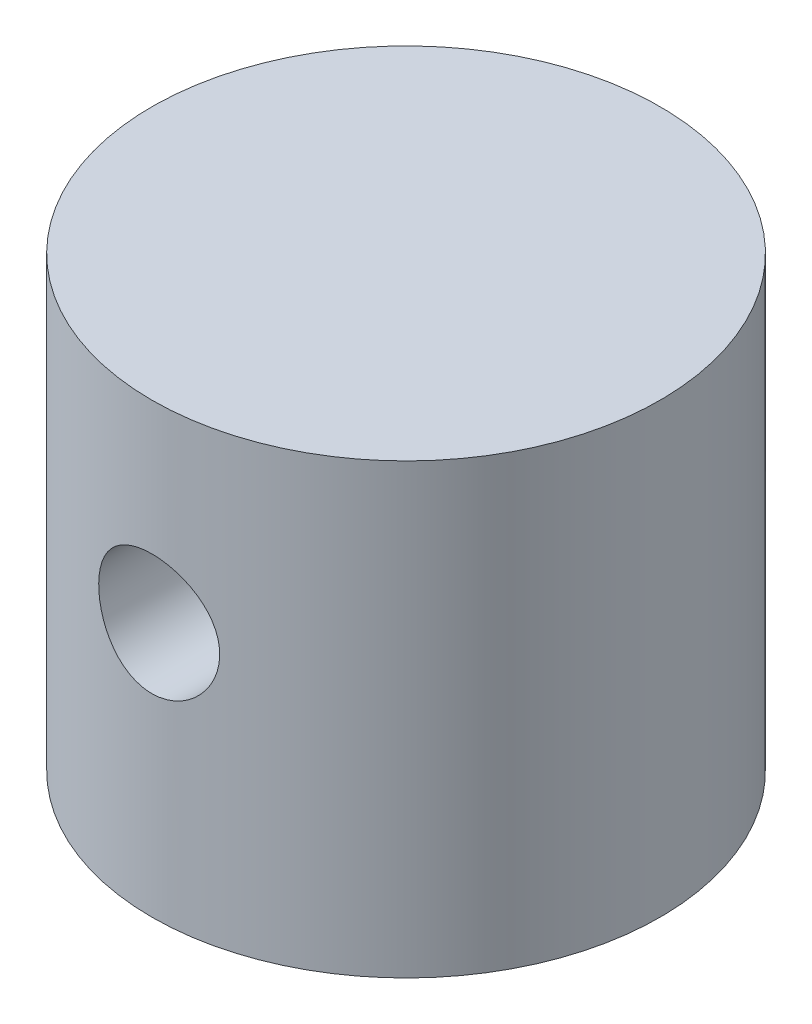
ISO-10303-21;
HEADER;
FILE_DESCRIPTION(('STEP AP214'),'2;1');
FILE_NAME('part.step','',(''),(''),'','','');
FILE_SCHEMA(('AUTOMOTIVE_DESIGN { 1 0 10303 214 1 1 1 1 }'));
ENDSEC;
DATA;
#1=APPLICATION_CONTEXT('core data for automotive mechanical design processes');
#2=APPLICATION_PROTOCOL_DEFINITION('international standard','automotive_design',2000,#1);
#3=PRODUCT_CONTEXT('',#1,'mechanical');
#4=PRODUCT('Part','Part','',(#3));
#5=PRODUCT_RELATED_PRODUCT_CATEGORY('part','',(#4));
#6=PRODUCT_DEFINITION_FORMATION('','',#4);
#7=PRODUCT_DEFINITION_CONTEXT('part definition',#1,'design');
#8=PRODUCT_DEFINITION('design','',#6,#7);
#9=PRODUCT_DEFINITION_SHAPE('','',#8);
#10=(LENGTH_UNIT() NAMED_UNIT(*) SI_UNIT(.MILLI.,.METRE.));
#11=(NAMED_UNIT(*) PLANE_ANGLE_UNIT() SI_UNIT($,.RADIAN.));
#12=(NAMED_UNIT(*) SI_UNIT($,.STERADIAN.) SOLID_ANGLE_UNIT());
#13=UNCERTAINTY_MEASURE_WITH_UNIT(LENGTH_MEASURE(1.E-05),#10,'distance_accuracy_value','');
#14=(GEOMETRIC_REPRESENTATION_CONTEXT(3) GLOBAL_UNCERTAINTY_ASSIGNED_CONTEXT((#13)) GLOBAL_UNIT_ASSIGNED_CONTEXT((#10,
#11,#12)) REPRESENTATION_CONTEXT('',''));
#15=CARTESIAN_POINT('',(0.,0.,0.));
#16=DIRECTION('',(0.,0.,1.));
#17=DIRECTION('',(1.,0.,0.));
#18=AXIS2_PLACEMENT_3D('',#15,#16,#17);
#19=CARTESIAN_POINT('',(2.7500000118,77.0000027942,22.5685520688));
#20=DIRECTION('',(0.,1.,0.));
#21=DIRECTION('',(0.,0.,1.));
#22=AXIS2_PLACEMENT_3D('',#19,#20,#21);
#23=CYLINDRICAL_SURFACE('',#22,6.2499999968);
#24=CARTESIAN_POINT('',(2.7500000118,77.0000027942,22.5685520688));
#25=DIRECTION('',(0.,1.,0.));
#26=DIRECTION('',(0.,0.,1.));
#27=AXIS2_PLACEMENT_3D('',#24,#25,#26);
#28=CIRCLE('',#27,6.2499999968);
#29=CARTESIAN_POINT('',(2.7500000118,77.0000027942,28.8185520656));
#30=VERTEX_POINT('',#29);
#31=CARTESIAN_POINT('',(2.7500000118,77.0000027942,16.318552072));
#32=VERTEX_POINT('',#31);
#33=EDGE_CURVE('E55',#30,#32,#28,.T.);
#34=ORIENTED_EDGE('',*,*,#33,.F.);
#35=DIRECTION('',(0.,1.,0.));
#36=VECTOR('',#35,1.);
#37=CARTESIAN_POINT('',(2.7500000118,82.2500027971,28.8185520656));
#38=LINE('',#37,#36);
#39=CARTESIAN_POINT('',(2.7500000118,87.5000028,28.8185520656));
#40=VERTEX_POINT('',#39);
#41=EDGE_CURVE('E51',#30,#40,#38,.T.);
#42=ORIENTED_EDGE('',*,*,#41,.T.);
#43=CARTESIAN_POINT('',(2.7500000118,87.5000028,22.5685520688));
#44=DIRECTION('',(0.,1.,0.));
#45=DIRECTION('',(0.,0.,1.));
#46=AXIS2_PLACEMENT_3D('',#43,#44,#45);
#47=CIRCLE('',#46,6.2499999968);
#48=CARTESIAN_POINT('',(2.7500000118,87.5000028,16.318552072));
#49=VERTEX_POINT('',#48);
#50=EDGE_CURVE('E20',#40,#49,#47,.T.);
#51=ORIENTED_EDGE('',*,*,#50,.T.);
#52=DIRECTION('',(0.,-1.,0.));
#53=VECTOR('',#52,1.);
#54=CARTESIAN_POINT('',(2.7500000118,82.2500027971,16.318552072));
#55=LINE('',#54,#53);
#56=EDGE_CURVE('E129',#49,#32,#55,.T.);
#57=ORIENTED_EDGE('',*,*,#56,.T.);
#58=EDGE_LOOP('',(#34,#42,#51,#57));
#59=FACE_BOUND('',#58,.T.);
#60=ADVANCED_FACE('F16',(#59),#23,.F.);
#61=CARTESIAN_POINT('',(-2.7500000118,77.0000027942,22.5685520688));
#62=DIRECTION('',(0.,1.,0.));
#63=DIRECTION('',(0.,0.,1.));
#64=AXIS2_PLACEMENT_3D('',#61,#62,#63);
#65=CYLINDRICAL_SURFACE('',#64,6.2499999968);
#66=CARTESIAN_POINT('',(-2.7500000118,77.0000027942,22.5685520688));
#67=DIRECTION('',(0.,1.,0.));
#68=DIRECTION('',(0.,0.,1.));
#69=AXIS2_PLACEMENT_3D('',#66,#67,#68);
#70=CIRCLE('',#69,6.2499999968);
#71=CARTESIAN_POINT('',(-2.7500000118,77.0000027942,16.318552072));
#72=VERTEX_POINT('',#71);
#73=CARTESIAN_POINT('',(-2.7500000118,77.0000027942,28.8185520656));
#74=VERTEX_POINT('',#73);
#75=EDGE_CURVE('E63',#72,#74,#70,.T.);
#76=ORIENTED_EDGE('',*,*,#75,.F.);
#77=DIRECTION('',(0.,1.,0.));
#78=VECTOR('',#77,1.);
#79=CARTESIAN_POINT('',(-2.7500000118,82.2500027971,16.318552072));
#80=LINE('',#79,#78);
#81=CARTESIAN_POINT('',(-2.7500000118,87.5000028,16.318552072));
#82=VERTEX_POINT('',#81);
#83=EDGE_CURVE('E35',#72,#82,#80,.T.);
#84=ORIENTED_EDGE('',*,*,#83,.T.);
#85=CARTESIAN_POINT('',(-2.7500000118,87.5000028,22.5685520688));
#86=DIRECTION('',(0.,1.,0.));
#87=DIRECTION('',(0.,0.,1.));
#88=AXIS2_PLACEMENT_3D('',#85,#86,#87);
#89=CIRCLE('',#88,6.2499999968);
#90=CARTESIAN_POINT('',(-2.7500000118,87.5000028,28.8185520656));
#91=VERTEX_POINT('',#90);
#92=EDGE_CURVE('E65',#82,#91,#89,.T.);
#93=ORIENTED_EDGE('',*,*,#92,.T.);
#94=DIRECTION('',(0.,-1.,0.));
#95=VECTOR('',#94,1.);
#96=CARTESIAN_POINT('',(-2.7500000118,82.2500027971,28.8185520656));
#97=LINE('',#96,#95);
#98=EDGE_CURVE('E60',#91,#74,#97,.T.);
#99=ORIENTED_EDGE('',*,*,#98,.T.);
#100=EDGE_LOOP('',(#76,#84,#93,#99));
#101=FACE_BOUND('',#100,.T.);
#102=ADVANCED_FACE('F62',(#101),#65,.F.);
#103=CARTESIAN_POINT('',(-9.1079999958,87.5000028,28.8185520656));
#104=DIRECTION('',(0.,1.,0.));
#105=DIRECTION('',(1.,0.,0.));
#106=AXIS2_PLACEMENT_3D('',#103,#104,#105);
#107=PLANE('',#106);
#108=ORIENTED_EDGE('',*,*,#92,.F.);
#109=DIRECTION('',(1.,0.,0.));
#110=VECTOR('',#109,1.);
#111=CARTESIAN_POINT('',(0.,87.5000028,16.318552072));
#112=LINE('',#111,#110);
#113=EDGE_CURVE('E125',#82,#49,#112,.T.);
#114=ORIENTED_EDGE('',*,*,#113,.T.);
#115=ORIENTED_EDGE('',*,*,#50,.F.);
#116=DIRECTION('',(-1.,0.,0.));
#117=VECTOR('',#116,1.);
#118=CARTESIAN_POINT('',(0.,87.5000028,28.8185520656));
#119=LINE('',#118,#117);
#120=EDGE_CURVE('E80',#40,#91,#119,.T.);
#121=ORIENTED_EDGE('',*,*,#120,.T.);
#122=EDGE_LOOP('',(#108,#114,#115,#121));
#123=FACE_BOUND('',#122,.T.);
#124=ADVANCED_FACE('F132',(#123),#107,.F.);
#125=CARTESIAN_POINT('',(-9.8670000018,77.0000027942,12.701552067));
#126=DIRECTION('',(0.,-1.,0.));
#127=DIRECTION('',(1.,0.,0.));
#128=AXIS2_PLACEMENT_3D('',#125,#126,#127);
#129=PLANE('',#128);
#130=DIRECTION('',(-1.,0.,0.));
#131=VECTOR('',#130,1.);
#132=CARTESIAN_POINT('',(0.,77.0000027942,16.318552072));
#133=LINE('',#132,#131);
#134=EDGE_CURVE('E76',#32,#72,#133,.T.);
#135=ORIENTED_EDGE('',*,*,#134,.T.);
#136=ORIENTED_EDGE('',*,*,#75,.T.);
#137=DIRECTION('',(1.,0.,0.));
#138=VECTOR('',#137,1.);
#139=CARTESIAN_POINT('',(0.,77.0000027942,28.8185520656));
#140=LINE('',#139,#138);
#141=EDGE_CURVE('E70',#74,#30,#140,.T.);
#142=ORIENTED_EDGE('',*,*,#141,.T.);
#143=ORIENTED_EDGE('',*,*,#33,.T.);
#144=EDGE_LOOP('',(#135,#136,#142,#143));
#145=FACE_BOUND('',#144,.T.);
#146=CARTESIAN_POINT('',(0.,77.0000027942,22.5685520688));
#147=DIRECTION('',(0.,-1.,0.));
#148=DIRECTION('',(0.,0.,-1.));
#149=AXIS2_PLACEMENT_3D('',#146,#147,#148);
#150=CIRCLE('',#149,9.7500000072);
#151=CARTESIAN_POINT('',(0.,77.0000027942,12.8185520616));
#152=VERTEX_POINT('',#151);
#153=EDGE_CURVE('E123',#152,#152,#150,.F.);
#154=ORIENTED_EDGE('',*,*,#153,.F.);
#155=EDGE_LOOP('',(#154));
#156=FACE_BOUND('',#155,.T.);
#157=ADVANCED_FACE('F73',(#145,#156),#129,.T.);
#158=CARTESIAN_POINT('',(-2.7500000118,77.0000027942,28.8185520656));
#159=DIRECTION('',(0.,0.,1.));
#160=DIRECTION('',(1.,0.,0.));
#161=AXIS2_PLACEMENT_3D('',#158,#159,#160);
#162=PLANE('',#161);
#163=CARTESIAN_POINT('',(0.,81.5000028112,28.8185520656));
#164=DIRECTION('',(0.,0.,-1.));
#165=DIRECTION('',(0.,1.,0.));
#166=AXIS2_PLACEMENT_3D('',#163,#164,#165);
#167=CIRCLE('',#166,2.5000000038);
#168=CARTESIAN_POINT('',(0.,84.000002815,28.8185520656));
#169=VERTEX_POINT('',#168);
#170=EDGE_CURVE('E120',#169,#169,#167,.T.);
#171=ORIENTED_EDGE('',*,*,#170,.F.);
#172=EDGE_LOOP('',(#171));
#173=FACE_BOUND('',#172,.T.);
#174=ORIENTED_EDGE('',*,*,#41,.F.);
#175=ORIENTED_EDGE('',*,*,#141,.F.);
#176=ORIENTED_EDGE('',*,*,#98,.F.);
#177=ORIENTED_EDGE('',*,*,#120,.F.);
#178=EDGE_LOOP('',(#174,#175,#176,#177));
#179=FACE_BOUND('',#178,.T.);
#180=ADVANCED_FACE('F78',(#173,#179),#162,.F.);
#181=CARTESIAN_POINT('',(2.7500000118,77.0000027942,16.318552072));
#182=DIRECTION('',(0.,0.,-1.));
#183=DIRECTION('',(-1.,0.,0.));
#184=AXIS2_PLACEMENT_3D('',#181,#182,#183);
#185=PLANE('',#184);
#186=CARTESIAN_POINT('',(0.,81.5000028112,16.318552072));
#187=DIRECTION('',(0.,0.,-1.));
#188=DIRECTION('',(-1.,0.,0.));
#189=AXIS2_PLACEMENT_3D('',#186,#187,#188);
#190=CIRCLE('',#189,2.49999997839999);
#191=CARTESIAN_POINT('',(-2.49999997839999,81.5000028112,16.318552072));
#192=VERTEX_POINT('',#191);
#193=EDGE_CURVE('E117',#192,#192,#190,.F.);
#194=ORIENTED_EDGE('',*,*,#193,.F.);
#195=EDGE_LOOP('',(#194));
#196=FACE_BOUND('',#195,.T.);
#197=ORIENTED_EDGE('',*,*,#83,.F.);
#198=ORIENTED_EDGE('',*,*,#134,.F.);
#199=ORIENTED_EDGE('',*,*,#56,.F.);
#200=ORIENTED_EDGE('',*,*,#113,.F.);
#201=EDGE_LOOP('',(#197,#198,#199,#200));
#202=FACE_BOUND('',#201,.T.);
#203=ADVANCED_FACE('F135',(#196,#202),#185,.F.);
#204=CARTESIAN_POINT('',(0.,77.0000027942,22.5685520688));
#205=DIRECTION('',(0.,-1.,0.));
#206=DIRECTION('',(0.,0.,-1.));
#207=AXIS2_PLACEMENT_3D('',#204,#205,#206);
#208=CYLINDRICAL_SURFACE('',#207,9.7500000072);
#209=ORIENTED_EDGE('',*,*,#153,.T.);
#210=EDGE_LOOP('',(#209));
#211=FACE_BOUND('',#210,.T.);
#212=CARTESIAN_POINT('',(0.,71.0000028054,22.5685520688));
#213=DIRECTION('',(0.,-1.,0.));
#214=DIRECTION('',(0.,0.,-1.));
#215=AXIS2_PLACEMENT_3D('',#212,#213,#214);
#216=CIRCLE('',#215,9.7500000072);
#217=CARTESIAN_POINT('',(0.,71.0000028054,12.8185520616));
#218=VERTEX_POINT('',#217);
#219=EDGE_CURVE('E114',#218,#218,#216,.T.);
#220=ORIENTED_EDGE('',*,*,#219,.T.);
#221=EDGE_LOOP('',(#220));
#222=FACE_BOUND('',#221,.T.);
#223=ADVANCED_FACE('F105',(#211,#222),#208,.F.);
#224=CARTESIAN_POINT('',(0.,81.5000028112,33.0940520744));
#225=DIRECTION('',(0.,0.,-1.));
#226=DIRECTION('',(0.,1.,0.));
#227=AXIS2_PLACEMENT_3D('',#224,#225,#226);
#228=CYLINDRICAL_SURFACE('',#227,2.5000000038);
#229=CARTESIAN_POINT('',(-3.7713360540755E-10,79.0000028074,33.0685520746));
#230=CARTESIAN_POINT('',(0.138292949162326,79.0000088104762,33.0685486359888));
#231=CARTESIAN_POINT('',(0.276666316818153,79.0115199167967,33.065791526457));
#232=CARTESIAN_POINT('',(0.549495294458109,79.0572123277179,33.0550553082801));
#233=CARTESIAN_POINT('',(0.683946912006523,79.0914159469237,33.0470710596478));
#234=CARTESIAN_POINT('',(0.944902494976897,79.1813442063632,33.0267675441859));
#235=CARTESIAN_POINT('',(1.0714163048271,79.2370415512946,33.0144537772521));
#236=CARTESIAN_POINT('',(1.31328838593754,79.3682873352447,32.9868106363306));
#237=CARTESIAN_POINT('',(1.42864768343932,79.4438339457022,32.9714815401548));
#238=CARTESIAN_POINT('',(1.6471181228244,79.6141328510857,32.9391554963471));
#239=CARTESIAN_POINT('',(1.74999059861146,79.7091868286104,32.9221348311348));
#240=CARTESIAN_POINT('',(1.93851585202774,79.9151825217857,32.8885011930524));
#241=CARTESIAN_POINT('',(2.02416322681473,80.026129203732,32.8718883495301));
#242=CARTESIAN_POINT('',(2.176907790891,80.262602520137,32.8407110291521));
#243=CARTESIAN_POINT('',(2.24373398396869,80.3883085088242,32.8261778268623));
#244=CARTESIAN_POINT('',(2.35515070225879,80.6494892229911,32.8011742363311));
#245=CARTESIAN_POINT('',(2.39976703668372,80.7849523993965,32.7906991354832));
#246=CARTESIAN_POINT('',(2.45493249937478,81.017589685083,32.7775584334899));
#247=CARTESIAN_POINT('',(2.47180433260113,81.1132317370785,32.7734684706912));
#248=CARTESIAN_POINT('',(2.49434002420838,81.3059035870767,32.7679835060553));
#249=CARTESIAN_POINT('',(2.50000425626235,81.4029333387034,32.7665884143683));
#250=CARTESIAN_POINT('',(2.49999394814265,81.6382331984911,32.7665949269213));
#251=CARTESIAN_POINT('',(2.48849290249047,81.7765441400631,32.7694332755252));
#252=CARTESIAN_POINT('',(2.44284409149619,82.0492432868921,32.7804589100827));
#253=CARTESIAN_POINT('',(2.40867379513108,82.1836274504393,32.7886515175264));
#254=CARTESIAN_POINT('',(2.31884291908126,82.4444401597286,32.8094053409451));
#255=CARTESIAN_POINT('',(2.26321117362932,82.5708791162154,32.8219606931775));
#256=CARTESIAN_POINT('',(2.13212008747362,82.8126246035409,32.8500177707591));
#257=CARTESIAN_POINT('',(2.05666242200129,82.927932073832,32.865519247139));
#258=CARTESIAN_POINT('',(1.88645550547646,83.1464559439028,32.8980684298321));
#259=CARTESIAN_POINT('',(1.79138456116535,83.2494184287094,32.9151388797596));
#260=CARTESIAN_POINT('',(1.58531651995732,83.4381188729591,32.9487086171724));
#261=CARTESIAN_POINT('',(1.47431469964639,83.5238517057483,32.9652077334534));
#262=CARTESIAN_POINT('',(1.23778816416601,83.6766897763536,32.996029053563));
#263=CARTESIAN_POINT('',(1.11209355900367,83.7435386323956,33.0103202023893));
#264=CARTESIAN_POINT('',(0.85093717652992,83.8550005054369,33.0348328875402));
#265=CARTESIAN_POINT('',(0.715486808836257,83.8996390297018,33.0450590894903));
#266=CARTESIAN_POINT('',(0.482791364845735,83.9548642330323,33.0578749273021));
#267=CARTESIAN_POINT('',(0.387073249429108,83.9717628763248,33.0618583770444));
#268=CARTESIAN_POINT('',(0.194249955506063,83.9943341072418,33.0671981189942));
#269=CARTESIAN_POINT('',(0.0971448187328565,84.0000070319163,33.0685544900793));
#270=CARTESIAN_POINT('',(-0.138292949535889,83.9999968119028,33.0685486359837));
#271=CARTESIAN_POINT('',(-0.276666317189838,83.9884857055618,33.0657915264471));
#272=CARTESIAN_POINT('',(-0.549495294826205,83.9427932945998,33.0550553082609));
#273=CARTESIAN_POINT('',(-0.683946912372738,83.9085896753726,33.0470710596239));
#274=CARTESIAN_POINT('',(-0.944902495334081,83.8186614158913,33.0267675441536));
#275=CARTESIAN_POINT('',(-1.07141630517726,83.7629640709398,33.0144537772161));
#276=CARTESIAN_POINT('',(-1.31328838626902,83.6317182869512,32.9868106362887));
#277=CARTESIAN_POINT('',(-1.42864768375925,83.5561716764756,32.9714815401107));
#278=CARTESIAN_POINT('',(-1.64711812311867,83.3858727710574,32.9391554963002));
#279=CARTESIAN_POINT('',(-1.74999059889152,83.2908187935161,32.9221348310873));
#280=CARTESIAN_POINT('',(-1.93851585227779,83.0848231003086,32.8885011930053));
#281=CARTESIAN_POINT('',(-2.02416322704881,82.9738764183467,32.871888349484));
#282=CARTESIAN_POINT('',(-2.17690779109031,82.7374031019129,32.8407110291097));
#283=CARTESIAN_POINT('',(-2.24373398414912,82.6116971132125,32.8261778268227));
#284=CARTESIAN_POINT('',(-2.35515070239682,82.350516399026,32.8011742362992));
#285=CARTESIAN_POINT('',(-2.39976703679917,82.2150532226145,32.7906991354561));
#286=CARTESIAN_POINT('',(-2.45493249903958,81.9824159386637,32.7775584335695));
#287=CARTESIAN_POINT('',(-2.47180433204038,81.8867738884559,32.773468470827));
#288=CARTESIAN_POINT('',(-2.49434002361447,81.6941020420607,32.7679835062005));
#289=CARTESIAN_POINT('',(-2.50000425586078,81.5970722922494,32.7665884144668));
#290=CARTESIAN_POINT('',(-2.49999394871439,81.3617724343013,32.7665949267812));
#291=CARTESIAN_POINT('',(-2.48849290364243,81.2234614927246,32.7694332752428));
#292=CARTESIAN_POINT('',(-2.44284409380403,80.9507623457811,32.7804589095293));
#293=CARTESIAN_POINT('',(-2.40867379801374,80.8163781821241,32.7886515168444));
#294=CARTESIAN_POINT('',(-2.31884292308727,80.5555654725111,32.8094053400354));
#295=CARTESIAN_POINT('',(-2.26321117818263,80.4291265158111,32.8219606921689));
#296=CARTESIAN_POINT('',(-2.13212009308319,80.1873810279737,32.8500177695923));
#297=CARTESIAN_POINT('',(-2.05666242811993,80.0720735573838,32.8655192459129));
#298=CARTESIAN_POINT('',(-1.88645551257933,79.8535496866391,32.8980684285307));
#299=CARTESIAN_POINT('',(-1.79138456874386,79.7505872014548,32.915138878443));
#300=CARTESIAN_POINT('',(-1.58531652842827,79.5618867563734,32.9487086158743));
#301=CARTESIAN_POINT('',(-1.47431470853419,79.4761539231298,32.9652077321888));
#302=CARTESIAN_POINT('',(-1.23778817377453,79.3233158515106,32.9960290524186));
#303=CARTESIAN_POINT('',(-1.11209356891015,79.2564669949154,33.0103202013311));
#304=CARTESIAN_POINT('',(-0.850937186931325,79.1450051207213,33.0348328866916));
#305=CARTESIAN_POINT('',(-0.715486819434325,79.1003665958576,33.0450590887649));
#306=CARTESIAN_POINT('',(-0.482791373957834,79.0451413910898,33.0578749268974));
#307=CARTESIAN_POINT('',(-0.387073256841002,79.0282427471661,33.061858376787));
#308=CARTESIAN_POINT('',(-0.194249959439768,79.0056715153954,33.0671981189374));
#309=CARTESIAN_POINT('',(-0.0971448208885841,78.9999985904984,33.0685544900758));
#310=CARTESIAN_POINT('',(-3.7713360540755E-10,79.0000028074,33.0685520746));
#311=B_SPLINE_CURVE_WITH_KNOTS('',3,(#229,#230,#231,#232,#233,#234,#235,#236,#237,#238,#239,
#240,#241,#242,#243,#244,#245,#246,#247,#248,#249,#250,#251,#252,#253,#254,#255,#256,#257,#258,
#259,#260,#261,#262,#263,#264,#265,#266,#267,#268,#269,#270,#271,#272,#273,#274,#275,#276,#277,
#278,#279,#280,#281,#282,#283,#284,#285,#286,#287,#288,#289,#290,#291,#292,#293,#294,#295,#296,
#297,#298,#299,#300,#301,#302,#303,#304,#305,#306,#307,#308,#309,#310),.UNSPECIFIED.,.T.,.F.,(4,
2,2,2,2,2,2,2,2,2,2,2,2,2,2,2,2,2,2,2,2,2,2,2,2,2,2,2,2,2,2,2,2,2,2,2,2,2,2,2,4),(0.,
0.414519465087844,0.829447151830915,1.24384963864003,1.65821396309076,2.07954829479025,
2.50101457722715,2.92827074786797,3.35502925490146,3.64599477367151,3.93695059118554,
4.35128200466613,4.76602584132296,5.18021438443412,5.59436794109112,6.0159486101899,
6.43765453477964,6.86483726163897,7.29152825520714,7.58271900309137,7.87390100789998,
8.28842047298326,8.70334815973841,9.11775064655326,9.53211497100556,9.95344930270779,
10.3749155851518,10.8021717558011,11.2289302628249,11.5198957762321,11.8108515883845,
12.2251830017233,12.6399268382536,13.0541153812621,13.468268937814,13.8898496067742,
14.3115555312233,14.7387382580985,15.1654292517006,15.4566200049127,15.7478020150482),.UNSPECIFIED.);
#312=CARTESIAN_POINT('',(-3.7713360540755E-10,79.0000028074,33.0685520746));
#313=VERTEX_POINT('',#312);
#314=EDGE_CURVE('E108',#313,#313,#311,.T.);
#315=ORIENTED_EDGE('',*,*,#314,.T.);
#316=EDGE_LOOP('',(#315));
#317=FACE_BOUND('',#316,.T.);
#318=ORIENTED_EDGE('',*,*,#170,.T.);
#319=EDGE_LOOP('',(#318));
#320=FACE_BOUND('',#319,.T.);
#321=ADVANCED_FACE('F101',(#317,#320),#228,.F.);
#322=CARTESIAN_POINT('',(-10.6260000078,89.5000028132,33.1945520766));
#323=DIRECTION('',(0.,1.,0.));
#324=DIRECTION('',(1.,0.,0.));
#325=AXIS2_PLACEMENT_3D('',#322,#323,#324);
#326=PLANE('',#325);
#327=CARTESIAN_POINT('',(0.,89.5000028132,22.5685520688));
#328=DIRECTION('',(0.,1.,0.));
#329=DIRECTION('',(0.,0.,1.));
#330=AXIS2_PLACEMENT_3D('',#327,#328,#329);
#331=CIRCLE('',#330,10.5000000058);
#332=CARTESIAN_POINT('',(0.,89.5000028132,33.0685520746));
#333=VERTEX_POINT('',#332);
#334=EDGE_CURVE('E91',#333,#333,#331,.T.);
#335=ORIENTED_EDGE('',*,*,#334,.T.);
#336=EDGE_LOOP('',(#335));
#337=FACE_BOUND('',#336,.T.);
#338=ADVANCED_FACE('F99',(#337),#326,.T.);
#339=CARTESIAN_POINT('',(0.,81.5000028112,16.318552072));
#340=DIRECTION('',(0.,0.,-1.));
#341=DIRECTION('',(-1.,0.,0.));
#342=AXIS2_PLACEMENT_3D('',#339,#340,#341);
#343=CYLINDRICAL_SURFACE('',#342,2.49999997839999);
#344=ORIENTED_EDGE('',*,*,#193,.T.);
#345=EDGE_LOOP('',(#344));
#346=FACE_BOUND('',#345,.T.);
#347=CARTESIAN_POINT('',(-3.58930840071765E-09,84.0000027951175,12.0685520574825));
#348=CARTESIAN_POINT('',(0.138180037235131,83.9999958387949,12.068555943001));
#349=CARTESIAN_POINT('',(0.276524922217059,83.9884961731678,12.0713101285763));
#350=CARTESIAN_POINT('',(0.549383815495761,83.9428251478384,12.0820413532446));
#351=CARTESIAN_POINT('',(0.683890002926812,83.9086105313293,12.0900283569782));
#352=CARTESIAN_POINT('',(0.944911139198951,83.8186571411482,12.1103375586862));
#353=CARTESIAN_POINT('',(1.07143879077153,83.7629536412573,12.1226526492181));
#354=CARTESIAN_POINT('',(1.31331062218942,83.6317043907757,12.1502963242714));
#355=CARTESIAN_POINT('',(1.42865788398746,83.5561641297461,12.1656240747842));
#356=CARTESIAN_POINT('',(1.64712644604853,83.3858658070533,12.1979499053328));
#357=CARTESIAN_POINT('',(1.75000666808244,83.290802975457,12.2149719442414));
#358=CARTESIAN_POINT('',(1.93852919454684,83.0848067053648,12.2486055543257));
#359=CARTESIAN_POINT('',(2.02416878243776,82.9738707705095,12.2652170604542));
#360=CARTESIAN_POINT('',(2.17686914401185,82.7374598475136,12.2963850798298));
#361=CARTESIAN_POINT('',(2.24366761214835,82.6118110809029,12.3109113162552));
#362=CARTESIAN_POINT('',(2.35510364252336,82.3506681126539,12.3359194347825));
#363=CARTESIAN_POINT('',(2.39974456539407,82.2151754076203,12.3464019301443));
#364=CARTESIAN_POINT('',(2.46479234698564,81.9408090119909,12.361892132303));
#365=CARTESIAN_POINT('',(2.48562716915189,81.8020423582881,12.3669963888149));
#366=CARTESIAN_POINT('',(2.50380345597192,81.5228964984286,12.3714415540984));
#367=CARTESIAN_POINT('',(2.50114833713365,81.3825175297422,12.3707833010017));
#368=CARTESIAN_POINT('',(2.4727627852508,81.1073736276778,12.363864874452));
#369=CARTESIAN_POINT('',(2.44753734695033,80.9725530372489,12.357727303479));
#370=CARTESIAN_POINT('',(2.37553029500118,80.7091134445256,12.3407364919073));
#371=CARTESIAN_POINT('',(2.32874712616912,80.5804948903884,12.3298829110969));
#372=CARTESIAN_POINT('',(2.21450763617692,80.331727843411,12.3045668468347));
#373=CARTESIAN_POINT('',(2.14686315937296,80.2116692143292,12.2900717493613));
#374=CARTESIAN_POINT('',(1.99295798067938,79.9844318987643,12.2591261948225));
#375=CARTESIAN_POINT('',(1.90669557952862,79.8772543893341,12.2426755593364));
#376=CARTESIAN_POINT('',(1.71538095128272,79.6759304656218,12.2091544168546));
#377=CARTESIAN_POINT('',(1.60990429559284,79.5821878124751,12.1920788213391));
#378=CARTESIAN_POINT('',(1.38447691854586,79.413609934321,12.1596053875626));
#379=CARTESIAN_POINT('',(1.2645199807557,79.3387828727979,12.1442082753168));
#380=CARTESIAN_POINT('',(1.01296074646036,79.2100339826933,12.1167591935709));
#381=CARTESIAN_POINT('',(0.881317608659031,79.1561893233732,12.1047196177389));
#382=CARTESIAN_POINT('',(0.610661943836915,79.0716054034855,12.0854516206136));
#383=CARTESIAN_POINT('',(0.471665452381363,79.0408179188143,12.0782131614288));
#384=CARTESIAN_POINT('',(0.276288327608246,79.0146973192725,12.0720425938045));
#385=CARTESIAN_POINT('',(0.221190671542693,79.0091920522877,12.0707367905463));
#386=CARTESIAN_POINT('',(0.110737502372053,79.0018434103137,12.0689907448533));
#387=CARTESIAN_POINT('',(0.0553819887155695,79.0000000431585,12.0685505042703));
#388=CARTESIAN_POINT('',(-0.138180046094568,79.0000097930545,12.068555952086));
#389=CARTESIAN_POINT('',(-0.276524931237295,79.011509452644,12.0713101312216));
#390=CARTESIAN_POINT('',(-0.549383823930518,79.0571804740687,12.0820413512817));
#391=CARTESIAN_POINT('',(-0.683890010630121,79.0913950926404,12.0900283568428));
#392=CARTESIAN_POINT('',(-0.944911145890976,79.181348484641,12.1103375599405));
#393=CARTESIAN_POINT('',(-1.07143879716168,79.2370519843537,12.1226526500506));
#394=CARTESIAN_POINT('',(-1.31331062824583,79.3683012351675,12.1502963248616));
#395=CARTESIAN_POINT('',(-1.42865788998283,79.4438414967592,12.1656240755617));
#396=CARTESIAN_POINT('',(-1.64712645176663,79.6141398203818,12.1979499062904));
#397=CARTESIAN_POINT('',(-1.75000667359202,79.7092026523316,12.2149719451877));
#398=CARTESIAN_POINT('',(-1.93852919945865,79.9151989230341,12.2486055552388));
#399=CARTESIAN_POINT('',(-2.02416878697954,80.0261348581285,12.2652170613459));
#400=CARTESIAN_POINT('',(-2.17686914779255,80.2625457815437,12.2963850806374));
#401=CARTESIAN_POINT('',(-2.24366761553504,80.3881945483353,12.3109113169992));
#402=CARTESIAN_POINT('',(-2.35510364511864,80.6493375169257,12.3359194353811));
#403=CARTESIAN_POINT('',(-2.39974456758416,80.7848302221231,12.3464019306596));
#404=CARTESIAN_POINT('',(-2.46479234833305,81.059196617952,12.36189213263));
#405=CARTESIAN_POINT('',(-2.48562717007095,81.1979632716897,12.3669963890393));
#406=CARTESIAN_POINT('',(-2.50380345603897,81.4771091315354,12.3714415541152));
#407=CARTESIAN_POINT('',(-2.50114833677828,81.6174881001732,12.3707833009139));
#408=CARTESIAN_POINT('',(-2.47276278407795,81.8926320021077,12.3638648741673));
#409=CARTESIAN_POINT('',(-2.44753734537568,82.0274525924564,12.3577273031002));
#410=CARTESIAN_POINT('',(-2.37553029264928,82.2908921849342,12.3407364913595));
#411=CARTESIAN_POINT('',(-2.32874712344497,82.4195107389073,12.3298829104749));
#412=CARTESIAN_POINT('',(-2.21450763273621,82.6682777855088,12.3045668460906));
#413=CARTESIAN_POINT('',(-2.14686315558661,82.7883364143774,12.2900717485694));
#414=CARTESIAN_POINT('',(-1.99295797619754,83.0155737295367,12.2591261939518));
#415=CARTESIAN_POINT('',(-1.90669557468632,83.122751238767,12.2426755584337));
#416=CARTESIAN_POINT('',(-1.71538094569223,83.3240751620404,12.2091544159306));
#417=CARTESIAN_POINT('',(-1.60990428960728,83.4178178149383,12.1920788204273));
#418=CARTESIAN_POINT('',(-1.38447691198,83.5863956924517,12.1596053866662));
#419=CARTESIAN_POINT('',(-1.26451997402755,83.6612227536127,12.1442082744209));
#420=CARTESIAN_POINT('',(-1.01296073958652,83.7899716426554,12.1167591929832));
#421=CARTESIAN_POINT('',(-0.881317601811851,83.843816301293,12.1047196174571));
#422=CARTESIAN_POINT('',(-0.610661936792172,83.9284002209908,12.0854516199067));
#423=CARTESIAN_POINT('',(-0.471665445091475,83.95918770609,12.078213160006));
#424=CARTESIAN_POINT('',(-0.276288322617503,83.9853083031969,12.0720425941128));
#425=CARTESIAN_POINT('',(-0.221190669134946,83.9908135691262,12.0707367916496));
#426=CARTESIAN_POINT('',(-0.110737505374126,83.9981622130329,12.0689907437594));
#427=CARTESIAN_POINT('',(-0.0553819945449415,84.000005583183,12.0685505001827));
#428=CARTESIAN_POINT('',(-3.58930840071765E-09,84.0000027951175,12.0685520574825));
#429=B_SPLINE_CURVE_WITH_KNOTS('',3,(#347,#348,#349,#350,#351,#352,#353,#354,#355,#356,#357,
#358,#359,#360,#361,#362,#363,#364,#365,#366,#367,#368,#369,#370,#371,#372,#373,#374,#375,#376,
#377,#378,#379,#380,#381,#382,#383,#384,#385,#386,#387,#388,#389,#390,#391,#392,#393,#394,#395,
#396,#397,#398,#399,#400,#401,#402,#403,#404,#405,#406,#407,#408,#409,#410,#411,#412,#413,#414,
#415,#416,#417,#418,#419,#420,#421,#422,#423,#424,#425,#426,#427,#428),.UNSPECIFIED.,.T.,.F.,(4,
2,2,2,2,2,2,2,2,2,2,2,2,2,2,2,2,2,2,2,2,2,2,2,2,2,2,2,2,2,2,2,2,2,2,2,2,2,2,2,4),(0.,
0.41432792984312,0.829447149548431,1.24388783504133,1.65821395020415,2.07958108248578,
2.50101455606962,2.92805427751719,3.35502921009554,3.77420127206355,4.19331236831272,
4.60327435352768,5.01326591819689,5.42706919541116,5.84091025650461,6.26534397819377,
6.68996056307003,7.11612439107679,7.54139438852009,7.70745496836494,7.87351590347318,
8.28784383321621,8.70296305124694,9.11740373623926,9.53172985198684,9.95309698459809,
10.3745304580417,10.8015701794025,11.2285451120441,11.6477171739152,12.0668282700455,
12.4767902552589,12.8867818198661,13.300585097052,13.7144261583535,14.138859880454,
14.5634764650675,14.9896402924405,15.4149102904052,15.5809708623826,15.7470317893177),.UNSPECIFIED.);
#430=CARTESIAN_POINT('',(-3.58930840071765E-09,84.0000027951175,12.0685520574825));
#431=VERTEX_POINT('',#430);
#432=EDGE_CURVE('E26',#431,#431,#429,.T.);
#433=ORIENTED_EDGE('',*,*,#432,.T.);
#434=EDGE_LOOP('',(#433));
#435=FACE_BOUND('',#434,.T.);
#436=ADVANCED_FACE('F95',(#346,#435),#343,.F.);
#437=CARTESIAN_POINT('',(-10.6260000078,71.0000028054,33.1945520766));
#438=DIRECTION('',(0.,1.,0.));
#439=DIRECTION('',(1.,0.,0.));
#440=AXIS2_PLACEMENT_3D('',#437,#438,#439);
#441=PLANE('',#440);
#442=ORIENTED_EDGE('',*,*,#219,.F.);
#443=EDGE_LOOP('',(#442));
#444=FACE_BOUND('',#443,.T.);
#445=CARTESIAN_POINT('',(0.,71.0000028054,22.5685520688));
#446=DIRECTION('',(0.,1.,0.));
#447=DIRECTION('',(0.,0.,1.));
#448=AXIS2_PLACEMENT_3D('',#445,#446,#447);
#449=CIRCLE('',#448,10.5000000058);
#450=CARTESIAN_POINT('',(0.,71.0000028054,33.0685520746));
#451=VERTEX_POINT('',#450);
#452=EDGE_CURVE('E11',#451,#451,#449,.F.);
#453=ORIENTED_EDGE('',*,*,#452,.T.);
#454=EDGE_LOOP('',(#453));
#455=FACE_BOUND('',#454,.T.);
#456=ADVANCED_FACE('F18',(#444,#455),#441,.F.);
#457=CARTESIAN_POINT('',(0.,71.0000028054,22.5685520688));
#458=DIRECTION('',(0.,1.,0.));
#459=DIRECTION('',(0.,0.,1.));
#460=AXIS2_PLACEMENT_3D('',#457,#458,#459);
#461=CYLINDRICAL_SURFACE('',#460,10.5000000058);
#462=ORIENTED_EDGE('',*,*,#314,.F.);
#463=EDGE_LOOP('',(#462));
#464=FACE_BOUND('',#463,.T.);
#465=ORIENTED_EDGE('',*,*,#334,.F.);
#466=EDGE_LOOP('',(#465));
#467=FACE_BOUND('',#466,.T.);
#468=ORIENTED_EDGE('',*,*,#432,.F.);
#469=EDGE_LOOP('',(#468));
#470=FACE_BOUND('',#469,.T.);
#471=ORIENTED_EDGE('',*,*,#452,.F.);
#472=EDGE_LOOP('',(#471));
#473=FACE_BOUND('',#472,.T.);
#474=ADVANCED_FACE('F93',(#464,#467,#470,#473),#461,.T.);
#475=CLOSED_SHELL('',(#60,#102,#124,#157,#180,#203,#223,#321,#338,#436,#456,#474));
#476=MANIFOLD_SOLID_BREP('B1',#475);
#477=ADVANCED_BREP_SHAPE_REPRESENTATION('',(#18,#476),#14);
#478=SHAPE_DEFINITION_REPRESENTATION(#9,#477);
ENDSEC;
END-ISO-10303-21;
